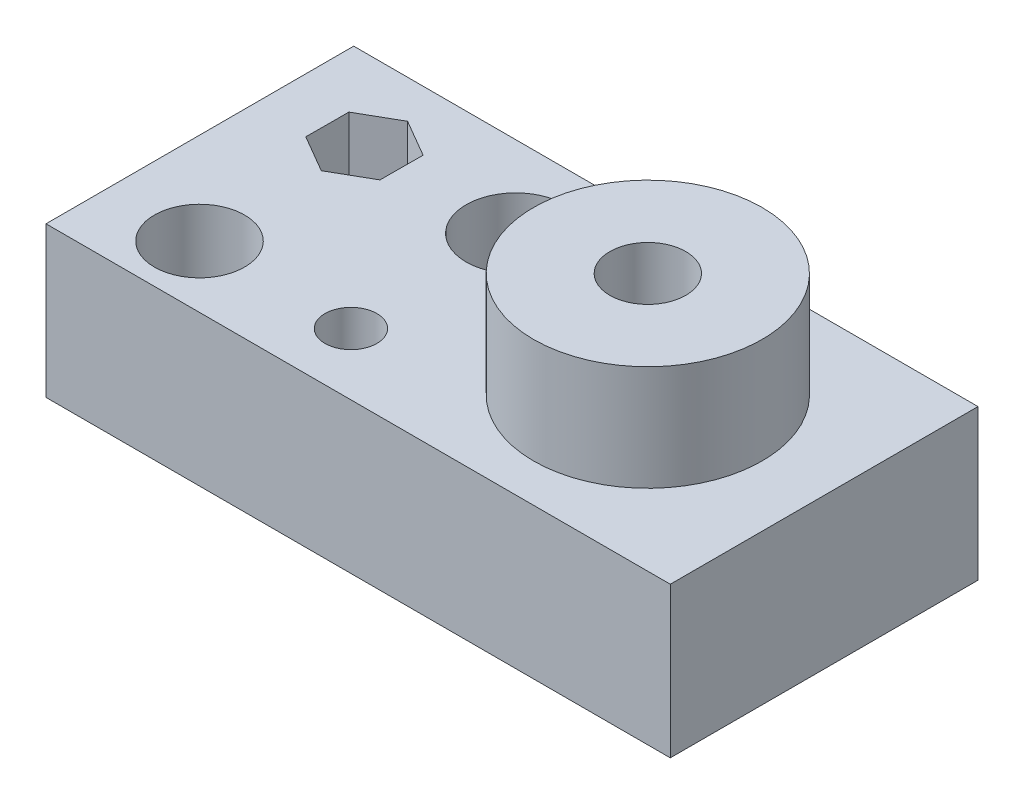
ISO-10303-21;
HEADER;
FILE_DESCRIPTION(('STEP AP214'),'2;1');
FILE_NAME('part.step','',(''),(''),'','','');
FILE_SCHEMA(('AUTOMOTIVE_DESIGN { 1 0 10303 214 1 1 1 1 }'));
ENDSEC;
DATA;
#1=APPLICATION_CONTEXT('core data for automotive mechanical design processes');
#2=APPLICATION_PROTOCOL_DEFINITION('international standard','automotive_design',2000,#1);
#3=PRODUCT_CONTEXT('',#1,'mechanical');
#4=PRODUCT('Part','Part','',(#3));
#5=PRODUCT_RELATED_PRODUCT_CATEGORY('part','',(#4));
#6=PRODUCT_DEFINITION_FORMATION('','',#4);
#7=PRODUCT_DEFINITION_CONTEXT('part definition',#1,'design');
#8=PRODUCT_DEFINITION('design','',#6,#7);
#9=PRODUCT_DEFINITION_SHAPE('','',#8);
#10=(LENGTH_UNIT() NAMED_UNIT(*) SI_UNIT(.MILLI.,.METRE.));
#11=(NAMED_UNIT(*) PLANE_ANGLE_UNIT() SI_UNIT($,.RADIAN.));
#12=(NAMED_UNIT(*) SI_UNIT($,.STERADIAN.) SOLID_ANGLE_UNIT());
#13=UNCERTAINTY_MEASURE_WITH_UNIT(LENGTH_MEASURE(1.E-05),#10,'distance_accuracy_value','');
#14=(GEOMETRIC_REPRESENTATION_CONTEXT(3) GLOBAL_UNCERTAINTY_ASSIGNED_CONTEXT((#13)) GLOBAL_UNIT_ASSIGNED_CONTEXT((#10,
#11,#12)) REPRESENTATION_CONTEXT('',''));
#15=CARTESIAN_POINT('',(0.,0.,0.));
#16=DIRECTION('',(0.,0.,1.));
#17=DIRECTION('',(1.,0.,0.));
#18=AXIS2_PLACEMENT_3D('',#15,#16,#17);
#19=CARTESIAN_POINT('',(0.,10.,0.));
#20=DIRECTION('',(0.,1.,0.));
#21=DIRECTION('',(0.,0.,1.));
#22=AXIS2_PLACEMENT_3D('',#19,#20,#21);
#23=PLANE('',#22);
#24=CARTESIAN_POINT('',(23.7601382506355,10.,4.91716979485766));
#25=DIRECTION('',(0.,1.,0.));
#26=DIRECTION('',(0.,0.,1.));
#27=AXIS2_PLACEMENT_3D('',#24,#25,#26);
#28=CIRCLE('',#27,7.6);
#29=CARTESIAN_POINT('',(23.7601382506355,10.,12.5171697948577));
#30=VERTEX_POINT('',#29);
#31=EDGE_CURVE('E313',#30,#30,#28,.T.);
#32=ORIENTED_EDGE('',*,*,#31,.F.);
#33=EDGE_LOOP('',(#32));
#34=FACE_BOUND('',#33,.T.);
#35=DIRECTION('',(-0.864202839059883,0.,-0.503143570922692));
#36=VECTOR('',#35,1.);
#37=CARTESIAN_POINT('',(2.48017599890368,10.,-1.41993908829293));
#38=LINE('',#37,#36);
#39=CARTESIAN_POINT('',(2.48017599890368,10.,-1.41993908829293));
#40=VERTEX_POINT('',#39);
#41=CARTESIAN_POINT('',(0.0103846771636468,10.,-2.85786496505349));
#42=VERTEX_POINT('',#41);
#43=EDGE_CURVE('E132',#40,#42,#38,.T.);
#44=ORIENTED_EDGE('',*,*,#43,.F.);
#45=DIRECTION('',(0.00363369463992671,0.,-0.999993398109839));
#46=VECTOR('',#45,1.);
#47=CARTESIAN_POINT('',(2.46979132174003,10.,1.43792587676057));
#48=LINE('',#47,#46);
#49=CARTESIAN_POINT('',(2.46979132174003,10.,1.43792587676057));
#50=VERTEX_POINT('',#49);
#51=EDGE_CURVE('E123',#50,#40,#48,.T.);
#52=ORIENTED_EDGE('',*,*,#51,.F.);
#53=DIRECTION('',(0.86783653369981,0.,-0.496849827187147));
#54=VECTOR('',#53,1.);
#55=CARTESIAN_POINT('',(-0.0103846771636478,10.,2.85786496505349));
#56=LINE('',#55,#54);
#57=CARTESIAN_POINT('',(-0.0103846771636476,10.,2.85786496505349));
#58=VERTEX_POINT('',#57);
#59=EDGE_CURVE('E160',#58,#50,#56,.T.);
#60=ORIENTED_EDGE('',*,*,#59,.F.);
#61=DIRECTION('',(0.864202839059883,0.,0.503143570922692));
#62=VECTOR('',#61,1.);
#63=CARTESIAN_POINT('',(-2.48017599890368,10.,1.41993908829293));
#64=LINE('',#63,#62);
#65=CARTESIAN_POINT('',(-2.48017599890368,10.,1.41993908829293));
#66=VERTEX_POINT('',#65);
#67=EDGE_CURVE('E157',#66,#58,#64,.T.);
#68=ORIENTED_EDGE('',*,*,#67,.F.);
#69=DIRECTION('',(-0.00363369463992716,0.,0.999993398109839));
#70=VECTOR('',#69,1.);
#71=CARTESIAN_POINT('',(-2.46979132174003,10.,-1.43792587676057));
#72=LINE('',#71,#70);
#73=CARTESIAN_POINT('',(-2.46979132174003,10.,-1.43792587676057));
#74=VERTEX_POINT('',#73);
#75=EDGE_CURVE('E151',#74,#66,#72,.T.);
#76=ORIENTED_EDGE('',*,*,#75,.F.);
#77=DIRECTION('',(-0.86783653369981,0.,0.496849827187148));
#78=VECTOR('',#77,1.);
#79=CARTESIAN_POINT('',(0.0103846771636468,10.,-2.85786496505349));
#80=LINE('',#79,#78);
#81=EDGE_CURVE('E147',#42,#74,#80,.T.);
#82=ORIENTED_EDGE('',*,*,#81,.F.);
#83=EDGE_LOOP('',(#44,#52,#60,#68,#76,#82));
#84=FACE_BOUND('',#83,.T.);
#85=CARTESIAN_POINT('',(10.0606129686685,10.,0.));
#86=DIRECTION('',(0.,1.,0.));
#87=DIRECTION('',(0.,0.,1.));
#88=AXIS2_PLACEMENT_3D('',#85,#86,#87);
#89=CIRCLE('',#88,3.3);
#90=CARTESIAN_POINT('',(10.0606129686685,10.,3.3));
#91=VERTEX_POINT('',#90);
#92=EDGE_CURVE('E195',#91,#91,#89,.T.);
#93=ORIENTED_EDGE('',*,*,#92,.F.);
#94=EDGE_LOOP('',(#93));
#95=FACE_BOUND('',#94,.T.);
#96=DIRECTION('',(0.,0.,1.));
#97=VECTOR('',#96,1.);
#98=CARTESIAN_POINT('',(-6.10771965094815,10.,-5.39400396695855));
#99=LINE('',#98,#97);
#100=CARTESIAN_POINT('',(-6.10771965094815,10.,-5.39400396695855));
#101=VERTEX_POINT('',#100);
#102=CARTESIAN_POINT('',(-6.10771965094815,10.,15.065851802956));
#103=VERTEX_POINT('',#102);
#104=EDGE_CURVE('E211',#101,#103,#99,.T.);
#105=ORIENTED_EDGE('',*,*,#104,.T.);
#106=DIRECTION('',(1.,0.,0.));
#107=VECTOR('',#106,1.);
#108=CARTESIAN_POINT('',(-6.10771965094815,10.,15.065851802956));
#109=LINE('',#108,#107);
#110=CARTESIAN_POINT('',(35.4018377768527,10.,15.065851802956));
#111=VERTEX_POINT('',#110);
#112=EDGE_CURVE('E215',#103,#111,#109,.T.);
#113=ORIENTED_EDGE('',*,*,#112,.T.);
#114=DIRECTION('',(0.,0.,-1.));
#115=VECTOR('',#114,1.);
#116=CARTESIAN_POINT('',(35.4018377768526,10.,-5.39400396695855));
#117=LINE('',#116,#115);
#118=CARTESIAN_POINT('',(35.4018377768526,10.,-5.39400396695855));
#119=VERTEX_POINT('',#118);
#120=EDGE_CURVE('E219',#111,#119,#117,.T.);
#121=ORIENTED_EDGE('',*,*,#120,.T.);
#122=DIRECTION('',(-1.,0.,0.));
#123=VECTOR('',#122,1.);
#124=CARTESIAN_POINT('',(-6.10771965094815,10.,-5.39400396695855));
#125=LINE('',#124,#123);
#126=EDGE_CURVE('E222',#119,#101,#125,.T.);
#127=ORIENTED_EDGE('',*,*,#126,.T.);
#128=EDGE_LOOP('',(#105,#113,#121,#127));
#129=FACE_BOUND('',#128,.T.);
#130=CARTESIAN_POINT('',(10.0606129686685,10.,10.957446633193));
#131=DIRECTION('',(0.,1.,0.));
#132=DIRECTION('',(0.,0.,1.));
#133=AXIS2_PLACEMENT_3D('',#130,#131,#132);
#134=CIRCLE('',#133,1.725);
#135=CARTESIAN_POINT('',(10.0606129686685,10.,12.682446633193));
#136=VERTEX_POINT('',#135);
#137=EDGE_CURVE('E203',#136,#136,#134,.T.);
#138=ORIENTED_EDGE('',*,*,#137,.F.);
#139=EDGE_LOOP('',(#138));
#140=FACE_BOUND('',#139,.T.);
#141=CARTESIAN_POINT('',(-0.0100699899768706,10.,10.957446633193));
#142=DIRECTION('',(0.,1.,0.));
#143=DIRECTION('',(0.,0.,1.));
#144=AXIS2_PLACEMENT_3D('',#141,#142,#143);
#145=CIRCLE('',#144,2.99999999999999);
#146=CARTESIAN_POINT('',(-0.0100699899768706,10.,13.957446633193));
#147=VERTEX_POINT('',#146);
#148=EDGE_CURVE('E165',#147,#147,#145,.T.);
#149=ORIENTED_EDGE('',*,*,#148,.F.);
#150=EDGE_LOOP('',(#149));
#151=FACE_BOUND('',#150,.T.);
#152=ADVANCED_FACE('F45',(#34,#84,#95,#129,#140,#151),#23,.T.);
#153=CARTESIAN_POINT('',(0.,0.,0.));
#154=DIRECTION('',(0.,1.,0.));
#155=DIRECTION('',(0.,0.,1.));
#156=AXIS2_PLACEMENT_3D('',#153,#154,#155);
#157=PLANE('',#156);
#158=CARTESIAN_POINT('',(23.7601382506355,0.,4.91716979485766));
#159=DIRECTION('',(0.,1.,0.));
#160=DIRECTION('',(0.,0.,1.));
#161=AXIS2_PLACEMENT_3D('',#158,#159,#160);
#162=CIRCLE('',#161,2.525);
#163=CARTESIAN_POINT('',(23.7601382506355,0.,7.44216979485766));
#164=VERTEX_POINT('',#163);
#165=EDGE_CURVE('E317',#164,#164,#162,.T.);
#166=ORIENTED_EDGE('',*,*,#165,.T.);
#167=EDGE_LOOP('',(#166));
#168=FACE_BOUND('',#167,.T.);
#169=CARTESIAN_POINT('',(10.0606129686685,0.,0.));
#170=DIRECTION('',(0.,1.,0.));
#171=DIRECTION('',(0.,0.,1.));
#172=AXIS2_PLACEMENT_3D('',#169,#170,#171);
#173=CIRCLE('',#172,3.3);
#174=CARTESIAN_POINT('',(10.0606129686685,0.,3.3));
#175=VERTEX_POINT('',#174);
#176=EDGE_CURVE('E141',#175,#175,#173,.T.);
#177=ORIENTED_EDGE('',*,*,#176,.T.);
#178=EDGE_LOOP('',(#177));
#179=FACE_BOUND('',#178,.T.);
#180=CARTESIAN_POINT('',(10.0606129686685,0.,10.957446633193));
#181=DIRECTION('',(0.,1.,0.));
#182=DIRECTION('',(0.,0.,1.));
#183=AXIS2_PLACEMENT_3D('',#180,#181,#182);
#184=CIRCLE('',#183,1.725);
#185=CARTESIAN_POINT('',(10.0606129686685,0.,12.682446633193));
#186=VERTEX_POINT('',#185);
#187=EDGE_CURVE('E199',#186,#186,#184,.T.);
#188=ORIENTED_EDGE('',*,*,#187,.T.);
#189=EDGE_LOOP('',(#188));
#190=FACE_BOUND('',#189,.T.);
#191=DIRECTION('',(0.,0.,1.));
#192=VECTOR('',#191,1.);
#193=CARTESIAN_POINT('',(-6.10771965094815,0.,-5.39400396695855));
#194=LINE('',#193,#192);
#195=CARTESIAN_POINT('',(-6.10771965094815,0.,-5.39400396695855));
#196=VERTEX_POINT('',#195);
#197=CARTESIAN_POINT('',(-6.10771965094815,0.,15.065851802956));
#198=VERTEX_POINT('',#197);
#199=EDGE_CURVE('E207',#196,#198,#194,.T.);
#200=ORIENTED_EDGE('',*,*,#199,.F.);
#201=DIRECTION('',(-1.,0.,0.));
#202=VECTOR('',#201,1.);
#203=CARTESIAN_POINT('',(-6.10771965094815,0.,-5.39400396695855));
#204=LINE('',#203,#202);
#205=CARTESIAN_POINT('',(35.4018377768526,0.,-5.39400396695855));
#206=VERTEX_POINT('',#205);
#207=EDGE_CURVE('E216',#206,#196,#204,.T.);
#208=ORIENTED_EDGE('',*,*,#207,.F.);
#209=DIRECTION('',(0.,0.,-1.));
#210=VECTOR('',#209,1.);
#211=CARTESIAN_POINT('',(35.4018377768526,0.,-5.39400396695855));
#212=LINE('',#211,#210);
#213=CARTESIAN_POINT('',(35.4018377768527,0.,15.065851802956));
#214=VERTEX_POINT('',#213);
#215=EDGE_CURVE('E232',#214,#206,#212,.T.);
#216=ORIENTED_EDGE('',*,*,#215,.F.);
#217=DIRECTION('',(1.,0.,0.));
#218=VECTOR('',#217,1.);
#219=CARTESIAN_POINT('',(-6.10771965094815,0.,15.065851802956));
#220=LINE('',#219,#218);
#221=EDGE_CURVE('E229',#198,#214,#220,.T.);
#222=ORIENTED_EDGE('',*,*,#221,.F.);
#223=EDGE_LOOP('',(#200,#208,#216,#222));
#224=FACE_BOUND('',#223,.T.);
#225=DIRECTION('',(0.00363369463992671,0.,-0.999993398109839));
#226=VECTOR('',#225,1.);
#227=CARTESIAN_POINT('',(2.46979132174003,0.,1.43792587676057));
#228=LINE('',#227,#226);
#229=CARTESIAN_POINT('',(2.46979132174003,0.,1.43792587676057));
#230=VERTEX_POINT('',#229);
#231=CARTESIAN_POINT('',(2.48017599890368,0.,-1.41993908829293));
#232=VERTEX_POINT('',#231);
#233=EDGE_CURVE('E69',#230,#232,#228,.T.);
#234=ORIENTED_EDGE('',*,*,#233,.T.);
#235=DIRECTION('',(-0.864202839059883,0.,-0.503143570922692));
#236=VECTOR('',#235,1.);
#237=CARTESIAN_POINT('',(2.48017599890368,0.,-1.41993908829293));
#238=LINE('',#237,#236);
#239=CARTESIAN_POINT('',(0.0103846771636468,0.,-2.85786496505349));
#240=VERTEX_POINT('',#239);
#241=EDGE_CURVE('E139',#232,#240,#238,.T.);
#242=ORIENTED_EDGE('',*,*,#241,.T.);
#243=DIRECTION('',(-0.86783653369981,0.,0.496849827187148));
#244=VECTOR('',#243,1.);
#245=CARTESIAN_POINT('',(0.0103846771636468,0.,-2.85786496505349));
#246=LINE('',#245,#244);
#247=CARTESIAN_POINT('',(-2.46979132174003,0.,-1.43792587676057));
#248=VERTEX_POINT('',#247);
#249=EDGE_CURVE('E168',#240,#248,#246,.T.);
#250=ORIENTED_EDGE('',*,*,#249,.T.);
#251=DIRECTION('',(-0.00363369463992716,0.,0.999993398109839));
#252=VECTOR('',#251,1.);
#253=CARTESIAN_POINT('',(-2.46979132174003,0.,-1.43792587676057));
#254=LINE('',#253,#252);
#255=CARTESIAN_POINT('',(-2.48017599890368,0.,1.41993908829293));
#256=VERTEX_POINT('',#255);
#257=EDGE_CURVE('E172',#248,#256,#254,.T.);
#258=ORIENTED_EDGE('',*,*,#257,.T.);
#259=DIRECTION('',(0.864202839059883,0.,0.503143570922692));
#260=VECTOR('',#259,1.);
#261=CARTESIAN_POINT('',(-2.48017599890368,0.,1.41993908829293));
#262=LINE('',#261,#260);
#263=CARTESIAN_POINT('',(-0.0103846771636478,0.,2.85786496505349));
#264=VERTEX_POINT('',#263);
#265=EDGE_CURVE('E176',#256,#264,#262,.T.);
#266=ORIENTED_EDGE('',*,*,#265,.T.);
#267=DIRECTION('',(0.86783653369981,0.,-0.496849827187147));
#268=VECTOR('',#267,1.);
#269=CARTESIAN_POINT('',(-0.0103846771636478,0.,2.85786496505349));
#270=LINE('',#269,#268);
#271=EDGE_CURVE('E133',#264,#230,#270,.T.);
#272=ORIENTED_EDGE('',*,*,#271,.T.);
#273=EDGE_LOOP('',(#234,#242,#250,#258,#266,#272));
#274=FACE_BOUND('',#273,.T.);
#275=CARTESIAN_POINT('',(-0.0100699899768706,0.,10.957446633193));
#276=DIRECTION('',(0.,1.,0.));
#277=DIRECTION('',(0.,0.,1.));
#278=AXIS2_PLACEMENT_3D('',#275,#276,#277);
#279=CIRCLE('',#278,2.99999999999999);
#280=CARTESIAN_POINT('',(-0.0100699899768706,0.,13.957446633193));
#281=VERTEX_POINT('',#280);
#282=EDGE_CURVE('E307',#281,#281,#279,.T.);
#283=ORIENTED_EDGE('',*,*,#282,.T.);
#284=EDGE_LOOP('',(#283));
#285=FACE_BOUND('',#284,.T.);
#286=ADVANCED_FACE('F255',(#168,#179,#190,#224,#274,#285),#157,.F.);
#287=CARTESIAN_POINT('',(-6.10771965094815,10.,-5.39400396695855));
#288=DIRECTION('',(1.,0.,0.));
#289=DIRECTION('',(0.,0.,-1.));
#290=AXIS2_PLACEMENT_3D('',#287,#288,#289);
#291=PLANE('',#290);
#292=ORIENTED_EDGE('',*,*,#199,.T.);
#293=DIRECTION('',(0.,-1.,0.));
#294=VECTOR('',#293,1.);
#295=CARTESIAN_POINT('',(-6.10771965094815,10.,15.065851802956));
#296=LINE('',#295,#294);
#297=EDGE_CURVE('E11',#103,#198,#296,.T.);
#298=ORIENTED_EDGE('',*,*,#297,.F.);
#299=ORIENTED_EDGE('',*,*,#104,.F.);
#300=DIRECTION('',(0.,-1.,0.));
#301=VECTOR('',#300,1.);
#302=CARTESIAN_POINT('',(-6.10771965094815,10.,-5.39400396695855));
#303=LINE('',#302,#301);
#304=EDGE_CURVE('E225',#101,#196,#303,.T.);
#305=ORIENTED_EDGE('',*,*,#304,.T.);
#306=EDGE_LOOP('',(#292,#298,#299,#305));
#307=FACE_BOUND('',#306,.T.);
#308=ADVANCED_FACE('F47',(#307),#291,.F.);
#309=CARTESIAN_POINT('',(-6.10771965094815,10.,15.065851802956));
#310=DIRECTION('',(0.,0.,-1.));
#311=DIRECTION('',(-1.,0.,0.));
#312=AXIS2_PLACEMENT_3D('',#309,#310,#311);
#313=PLANE('',#312);
#314=ORIENTED_EDGE('',*,*,#221,.T.);
#315=DIRECTION('',(0.,-1.,0.));
#316=VECTOR('',#315,1.);
#317=CARTESIAN_POINT('',(35.4018377768527,10.,15.065851802956));
#318=LINE('',#317,#316);
#319=EDGE_CURVE('E54',#111,#214,#318,.T.);
#320=ORIENTED_EDGE('',*,*,#319,.F.);
#321=ORIENTED_EDGE('',*,*,#112,.F.);
#322=ORIENTED_EDGE('',*,*,#297,.T.);
#323=EDGE_LOOP('',(#314,#320,#321,#322));
#324=FACE_BOUND('',#323,.T.);
#325=ADVANCED_FACE('F266',(#324),#313,.F.);
#326=CARTESIAN_POINT('',(35.4018377768526,10.,-5.39400396695855));
#327=DIRECTION('',(-1.,0.,0.));
#328=DIRECTION('',(0.,0.,1.));
#329=AXIS2_PLACEMENT_3D('',#326,#327,#328);
#330=PLANE('',#329);
#331=ORIENTED_EDGE('',*,*,#215,.T.);
#332=DIRECTION('',(0.,-1.,0.));
#333=VECTOR('',#332,1.);
#334=CARTESIAN_POINT('',(35.4018377768526,10.,-5.39400396695855));
#335=LINE('',#334,#333);
#336=EDGE_CURVE('E240',#119,#206,#335,.T.);
#337=ORIENTED_EDGE('',*,*,#336,.F.);
#338=ORIENTED_EDGE('',*,*,#120,.F.);
#339=ORIENTED_EDGE('',*,*,#319,.T.);
#340=EDGE_LOOP('',(#331,#337,#338,#339));
#341=FACE_BOUND('',#340,.T.);
#342=ADVANCED_FACE('F249',(#341),#330,.F.);
#343=CARTESIAN_POINT('',(-6.10771965094815,10.,-5.39400396695855));
#344=DIRECTION('',(0.,0.,1.));
#345=DIRECTION('',(1.,0.,0.));
#346=AXIS2_PLACEMENT_3D('',#343,#344,#345);
#347=PLANE('',#346);
#348=ORIENTED_EDGE('',*,*,#207,.T.);
#349=ORIENTED_EDGE('',*,*,#304,.F.);
#350=ORIENTED_EDGE('',*,*,#126,.F.);
#351=ORIENTED_EDGE('',*,*,#336,.T.);
#352=EDGE_LOOP('',(#348,#349,#350,#351));
#353=FACE_BOUND('',#352,.T.);
#354=ADVANCED_FACE('F259',(#353),#347,.F.);
#355=CARTESIAN_POINT('',(10.0606129686685,10.,10.957446633193));
#356=DIRECTION('',(0.,-1.,0.));
#357=DIRECTION('',(0.,0.,-1.));
#358=AXIS2_PLACEMENT_3D('',#355,#356,#357);
#359=CYLINDRICAL_SURFACE('',#358,1.725);
#360=ORIENTED_EDGE('',*,*,#137,.T.);
#361=EDGE_LOOP('',(#360));
#362=FACE_BOUND('',#361,.T.);
#363=ORIENTED_EDGE('',*,*,#187,.F.);
#364=EDGE_LOOP('',(#363));
#365=FACE_BOUND('',#364,.T.);
#366=ADVANCED_FACE('F285',(#362,#365),#359,.F.);
#367=CARTESIAN_POINT('',(10.0606129686685,10.,0.));
#368=DIRECTION('',(0.,-1.,0.));
#369=DIRECTION('',(0.,0.,-1.));
#370=AXIS2_PLACEMENT_3D('',#367,#368,#369);
#371=CYLINDRICAL_SURFACE('',#370,3.3);
#372=ORIENTED_EDGE('',*,*,#92,.T.);
#373=EDGE_LOOP('',(#372));
#374=FACE_BOUND('',#373,.T.);
#375=ORIENTED_EDGE('',*,*,#176,.F.);
#376=EDGE_LOOP('',(#375));
#377=FACE_BOUND('',#376,.T.);
#378=ADVANCED_FACE('F292',(#374,#377),#371,.F.);
#379=CARTESIAN_POINT('',(2.46979132174003,10.,1.43792587676057));
#380=DIRECTION('',(-0.999993398109839,0.,-0.00363369463992671));
#381=DIRECTION('',(-0.00363369463992671,0.,0.999993398109839));
#382=AXIS2_PLACEMENT_3D('',#379,#380,#381);
#383=PLANE('',#382);
#384=ORIENTED_EDGE('',*,*,#233,.F.);
#385=DIRECTION('',(0.,-1.,0.));
#386=VECTOR('',#385,1.);
#387=CARTESIAN_POINT('',(2.46979132174003,10.,1.43792587676057));
#388=LINE('',#387,#386);
#389=EDGE_CURVE('E127',#50,#230,#388,.T.);
#390=ORIENTED_EDGE('',*,*,#389,.F.);
#391=ORIENTED_EDGE('',*,*,#51,.T.);
#392=DIRECTION('',(0.,-1.,0.));
#393=VECTOR('',#392,1.);
#394=CARTESIAN_POINT('',(2.48017599890368,10.,-1.41993908829293));
#395=LINE('',#394,#393);
#396=EDGE_CURVE('E126',#40,#232,#395,.T.);
#397=ORIENTED_EDGE('',*,*,#396,.T.);
#398=EDGE_LOOP('',(#384,#390,#391,#397));
#399=FACE_BOUND('',#398,.T.);
#400=ADVANCED_FACE('F125',(#399),#383,.T.);
#401=CARTESIAN_POINT('',(2.48017599890368,10.,-1.41993908829293));
#402=DIRECTION('',(-0.503143570922692,0.,0.864202839059883));
#403=DIRECTION('',(0.864202839059883,0.,0.503143570922692));
#404=AXIS2_PLACEMENT_3D('',#401,#402,#403);
#405=PLANE('',#404);
#406=ORIENTED_EDGE('',*,*,#241,.F.);
#407=ORIENTED_EDGE('',*,*,#396,.F.);
#408=ORIENTED_EDGE('',*,*,#43,.T.);
#409=DIRECTION('',(0.,-1.,0.));
#410=VECTOR('',#409,1.);
#411=CARTESIAN_POINT('',(0.0103846771636468,10.,-2.85786496505349));
#412=LINE('',#411,#410);
#413=EDGE_CURVE('E142',#42,#240,#412,.T.);
#414=ORIENTED_EDGE('',*,*,#413,.T.);
#415=EDGE_LOOP('',(#406,#407,#408,#414));
#416=FACE_BOUND('',#415,.T.);
#417=ADVANCED_FACE('F136',(#416),#405,.T.);
#418=CARTESIAN_POINT('',(0.0103846771636468,10.,-2.85786496505349));
#419=DIRECTION('',(0.496849827187148,0.,0.86783653369981));
#420=DIRECTION('',(0.86783653369981,0.,-0.496849827187148));
#421=AXIS2_PLACEMENT_3D('',#418,#419,#420);
#422=PLANE('',#421);
#423=ORIENTED_EDGE('',*,*,#249,.F.);
#424=ORIENTED_EDGE('',*,*,#413,.F.);
#425=ORIENTED_EDGE('',*,*,#81,.T.);
#426=DIRECTION('',(0.,-1.,0.));
#427=VECTOR('',#426,1.);
#428=CARTESIAN_POINT('',(-2.46979132174003,10.,-1.43792587676057));
#429=LINE('',#428,#427);
#430=EDGE_CURVE('E190',#74,#248,#429,.T.);
#431=ORIENTED_EDGE('',*,*,#430,.T.);
#432=EDGE_LOOP('',(#423,#424,#425,#431));
#433=FACE_BOUND('',#432,.T.);
#434=ADVANCED_FACE('F360',(#433),#422,.T.);
#435=CARTESIAN_POINT('',(-2.46979132174003,10.,-1.43792587676057));
#436=DIRECTION('',(0.999993398109839,0.,0.00363369463992716));
#437=DIRECTION('',(0.00363369463992716,0.,-0.999993398109839));
#438=AXIS2_PLACEMENT_3D('',#435,#436,#437);
#439=PLANE('',#438);
#440=ORIENTED_EDGE('',*,*,#257,.F.);
#441=ORIENTED_EDGE('',*,*,#430,.F.);
#442=ORIENTED_EDGE('',*,*,#75,.T.);
#443=DIRECTION('',(0.,-1.,0.));
#444=VECTOR('',#443,1.);
#445=CARTESIAN_POINT('',(-2.48017599890368,10.,1.41993908829293));
#446=LINE('',#445,#444);
#447=EDGE_CURVE('E187',#66,#256,#446,.T.);
#448=ORIENTED_EDGE('',*,*,#447,.T.);
#449=EDGE_LOOP('',(#440,#441,#442,#448));
#450=FACE_BOUND('',#449,.T.);
#451=ADVANCED_FACE('F356',(#450),#439,.T.);
#452=CARTESIAN_POINT('',(-2.48017599890368,10.,1.41993908829293));
#453=DIRECTION('',(0.503143570922692,0.,-0.864202839059883));
#454=DIRECTION('',(-0.864202839059883,0.,-0.503143570922692));
#455=AXIS2_PLACEMENT_3D('',#452,#453,#454);
#456=PLANE('',#455);
#457=ORIENTED_EDGE('',*,*,#265,.F.);
#458=ORIENTED_EDGE('',*,*,#447,.F.);
#459=ORIENTED_EDGE('',*,*,#67,.T.);
#460=DIRECTION('',(0.,-1.,0.));
#461=VECTOR('',#460,1.);
#462=CARTESIAN_POINT('',(-0.0103846771636478,10.,2.85786496505349));
#463=LINE('',#462,#461);
#464=EDGE_CURVE('E61',#58,#264,#463,.T.);
#465=ORIENTED_EDGE('',*,*,#464,.T.);
#466=EDGE_LOOP('',(#457,#458,#459,#465));
#467=FACE_BOUND('',#466,.T.);
#468=ADVANCED_FACE('F353',(#467),#456,.T.);
#469=CARTESIAN_POINT('',(-0.0103846771636478,10.,2.85786496505349));
#470=DIRECTION('',(-0.496849827187147,0.,-0.86783653369981));
#471=DIRECTION('',(-0.86783653369981,0.,0.496849827187147));
#472=AXIS2_PLACEMENT_3D('',#469,#470,#471);
#473=PLANE('',#472);
#474=ORIENTED_EDGE('',*,*,#271,.F.);
#475=ORIENTED_EDGE('',*,*,#464,.F.);
#476=ORIENTED_EDGE('',*,*,#59,.T.);
#477=ORIENTED_EDGE('',*,*,#389,.T.);
#478=EDGE_LOOP('',(#474,#475,#476,#477));
#479=FACE_BOUND('',#478,.T.);
#480=ADVANCED_FACE('F348',(#479),#473,.T.);
#481=CARTESIAN_POINT('',(-0.0100699899768706,10.,10.957446633193));
#482=DIRECTION('',(0.,-1.,0.));
#483=DIRECTION('',(0.,0.,-1.));
#484=AXIS2_PLACEMENT_3D('',#481,#482,#483);
#485=CYLINDRICAL_SURFACE('',#484,2.99999999999999);
#486=ORIENTED_EDGE('',*,*,#148,.T.);
#487=EDGE_LOOP('',(#486));
#488=FACE_BOUND('',#487,.T.);
#489=ORIENTED_EDGE('',*,*,#282,.F.);
#490=EDGE_LOOP('',(#489));
#491=FACE_BOUND('',#490,.T.);
#492=ADVANCED_FACE('F344',(#488,#491),#485,.F.);
#493=CARTESIAN_POINT('',(23.7601382506355,17.,4.91716979485766));
#494=DIRECTION('',(0.,-1.,0.));
#495=DIRECTION('',(0.,0.,-1.));
#496=AXIS2_PLACEMENT_3D('',#493,#494,#495);
#497=CYLINDRICAL_SURFACE('',#496,7.6);
#498=CARTESIAN_POINT('',(23.7601382506355,17.,4.91716979485766));
#499=DIRECTION('',(0.,1.,0.));
#500=DIRECTION('',(0.,0.,1.));
#501=AXIS2_PLACEMENT_3D('',#498,#499,#500);
#502=CIRCLE('',#501,7.6);
#503=CARTESIAN_POINT('',(23.7601382506355,17.,12.5171697948577));
#504=VERTEX_POINT('',#503);
#505=EDGE_CURVE('E311',#504,#504,#502,.T.);
#506=ORIENTED_EDGE('',*,*,#505,.F.);
#507=EDGE_LOOP('',(#506));
#508=FACE_BOUND('',#507,.T.);
#509=ORIENTED_EDGE('',*,*,#31,.T.);
#510=EDGE_LOOP('',(#509));
#511=FACE_BOUND('',#510,.T.);
#512=ADVANCED_FACE('F339',(#508,#511),#497,.T.);
#513=CARTESIAN_POINT('',(23.7601382506355,17.,4.91716979485766));
#514=DIRECTION('',(0.,1.,0.));
#515=DIRECTION('',(0.,0.,1.));
#516=AXIS2_PLACEMENT_3D('',#513,#514,#515);
#517=PLANE('',#516);
#518=CARTESIAN_POINT('',(23.7601382506355,17.,4.91716979485766));
#519=DIRECTION('',(0.,1.,0.));
#520=DIRECTION('',(0.,0.,1.));
#521=AXIS2_PLACEMENT_3D('',#518,#519,#520);
#522=CIRCLE('',#521,2.525);
#523=CARTESIAN_POINT('',(23.7601382506355,17.,7.44216979485766));
#524=VERTEX_POINT('',#523);
#525=EDGE_CURVE('E321',#524,#524,#522,.T.);
#526=ORIENTED_EDGE('',*,*,#525,.F.);
#527=EDGE_LOOP('',(#526));
#528=FACE_BOUND('',#527,.T.);
#529=ORIENTED_EDGE('',*,*,#505,.T.);
#530=EDGE_LOOP('',(#529));
#531=FACE_BOUND('',#530,.T.);
#532=ADVANCED_FACE('F333',(#528,#531),#517,.T.);
#533=CARTESIAN_POINT('',(23.7601382506355,0.,4.91716979485766));
#534=DIRECTION('',(0.,1.,0.));
#535=DIRECTION('',(0.,0.,1.));
#536=AXIS2_PLACEMENT_3D('',#533,#534,#535);
#537=CYLINDRICAL_SURFACE('',#536,2.525);
#538=ORIENTED_EDGE('',*,*,#165,.F.);
#539=EDGE_LOOP('',(#538));
#540=FACE_BOUND('',#539,.T.);
#541=ORIENTED_EDGE('',*,*,#525,.T.);
#542=EDGE_LOOP('',(#541));
#543=FACE_BOUND('',#542,.T.);
#544=ADVANCED_FACE('F330',(#540,#543),#537,.F.);
#545=CLOSED_SHELL('',(#152,#286,#308,#325,#342,#354,#366,#378,#400,#417,#434,#451,#468,#480,
#492,#512,#532,#544));
#546=MANIFOLD_SOLID_BREP('B2',#545);
#547=ADVANCED_BREP_SHAPE_REPRESENTATION('',(#18,#546),#14);
#548=SHAPE_DEFINITION_REPRESENTATION(#9,#547);
ENDSEC;
END-ISO-10303-21;
